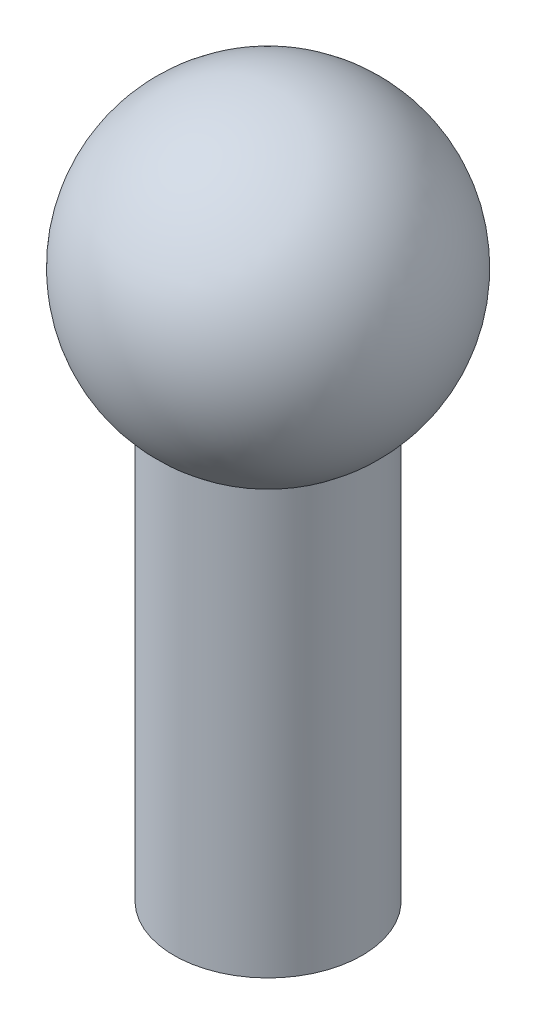
ISO-10303-21;
HEADER;
FILE_DESCRIPTION(('STEP AP214'),'2;1');
FILE_NAME('part.step','',(''),(''),'','','');
FILE_SCHEMA(('AUTOMOTIVE_DESIGN { 1 0 10303 214 1 1 1 1 }'));
ENDSEC;
DATA;
#1=APPLICATION_CONTEXT('core data for automotive mechanical design processes');
#2=APPLICATION_PROTOCOL_DEFINITION('international standard','automotive_design',2000,#1);
#3=PRODUCT_CONTEXT('',#1,'mechanical');
#4=PRODUCT('Part','Part','',(#3));
#5=PRODUCT_RELATED_PRODUCT_CATEGORY('part','',(#4));
#6=PRODUCT_DEFINITION_FORMATION('','',#4);
#7=PRODUCT_DEFINITION_CONTEXT('part definition',#1,'design');
#8=PRODUCT_DEFINITION('design','',#6,#7);
#9=PRODUCT_DEFINITION_SHAPE('','',#8);
#10=(LENGTH_UNIT() NAMED_UNIT(*) SI_UNIT(.MILLI.,.METRE.));
#11=(NAMED_UNIT(*) PLANE_ANGLE_UNIT() SI_UNIT($,.RADIAN.));
#12=(NAMED_UNIT(*) SI_UNIT($,.STERADIAN.) SOLID_ANGLE_UNIT());
#13=UNCERTAINTY_MEASURE_WITH_UNIT(LENGTH_MEASURE(1.E-05),#10,'distance_accuracy_value','');
#14=(GEOMETRIC_REPRESENTATION_CONTEXT(3) GLOBAL_UNCERTAINTY_ASSIGNED_CONTEXT((#13)) GLOBAL_UNIT_ASSIGNED_CONTEXT((#10,
#11,#12)) REPRESENTATION_CONTEXT('',''));
#15=CARTESIAN_POINT('',(0.,0.,0.));
#16=DIRECTION('',(0.,0.,1.));
#17=DIRECTION('',(1.,0.,0.));
#18=AXIS2_PLACEMENT_3D('',#15,#16,#17);
#19=CARTESIAN_POINT('',(0.,70.,0.));
#20=DIRECTION('',(0.,-1.,0.));
#21=DIRECTION('',(1.,0.,0.));
#22=AXIS2_PLACEMENT_3D('',#19,#20,#21);
#23=SPHERICAL_SURFACE('',#22,20.);
#24=CARTESIAN_POINT('',(0.,54.,0.));
#25=DIRECTION('',(0.,-1.,0.));
#26=DIRECTION('',(0.,0.,-1.));
#27=AXIS2_PLACEMENT_3D('',#24,#25,#26);
#28=CIRCLE('',#27,12.);
#29=CARTESIAN_POINT('',(0.,54.,-12.));
#30=VERTEX_POINT('',#29);
#31=EDGE_CURVE('E10',#30,#30,#28,.T.);
#32=ORIENTED_EDGE('',*,*,#31,.F.);
#33=EDGE_LOOP('',(#32));
#34=FACE_BOUND('',#33,.T.);
#35=ADVANCED_FACE('F43',(#34),#23,.T.);
#36=CARTESIAN_POINT('',(0.,0.,0.));
#37=DIRECTION('',(0.,-1.,0.));
#38=DIRECTION('',(0.,0.,-1.));
#39=AXIS2_PLACEMENT_3D('',#36,#37,#38);
#40=CYLINDRICAL_SURFACE('',#39,12.);
#41=CARTESIAN_POINT('',(0.,0.,0.));
#42=DIRECTION('',(0.,-1.,0.));
#43=DIRECTION('',(0.,0.,-1.));
#44=AXIS2_PLACEMENT_3D('',#41,#42,#43);
#45=CIRCLE('',#44,12.);
#46=CARTESIAN_POINT('',(0.,0.,-12.));
#47=VERTEX_POINT('',#46);
#48=EDGE_CURVE('E49',#47,#47,#45,.T.);
#49=ORIENTED_EDGE('',*,*,#48,.F.);
#50=EDGE_LOOP('',(#49));
#51=FACE_BOUND('',#50,.T.);
#52=ORIENTED_EDGE('',*,*,#31,.T.);
#53=EDGE_LOOP('',(#52));
#54=FACE_BOUND('',#53,.T.);
#55=ADVANCED_FACE('F67',(#51,#54),#40,.T.);
#56=CARTESIAN_POINT('',(0.,0.,0.));
#57=DIRECTION('',(0.,1.,0.));
#58=DIRECTION('',(0.,0.,1.));
#59=AXIS2_PLACEMENT_3D('',#56,#57,#58);
#60=PLANE('',#59);
#61=CARTESIAN_POINT('',(0.,0.,0.));
#62=DIRECTION('',(0.,-1.,0.));
#63=DIRECTION('',(0.,0.,-1.));
#64=AXIS2_PLACEMENT_3D('',#61,#62,#63);
#65=CIRCLE('',#64,10.);
#66=CARTESIAN_POINT('',(0.,0.,-10.));
#67=VERTEX_POINT('',#66);
#68=EDGE_CURVE('E57',#67,#67,#65,.T.);
#69=ORIENTED_EDGE('',*,*,#68,.F.);
#70=EDGE_LOOP('',(#69));
#71=FACE_BOUND('',#70,.T.);
#72=ORIENTED_EDGE('',*,*,#48,.T.);
#73=EDGE_LOOP('',(#72));
#74=FACE_BOUND('',#73,.T.);
#75=ADVANCED_FACE('F65',(#71,#74),#60,.F.);
#76=CARTESIAN_POINT('',(0.,30.,0.));
#77=DIRECTION('',(0.,-1.,0.));
#78=DIRECTION('',(0.,0.,-1.));
#79=AXIS2_PLACEMENT_3D('',#76,#77,#78);
#80=CYLINDRICAL_SURFACE('',#79,10.);
#81=CARTESIAN_POINT('',(0.,30.,0.));
#82=DIRECTION('',(0.,-1.,0.));
#83=DIRECTION('',(0.,0.,-1.));
#84=AXIS2_PLACEMENT_3D('',#81,#82,#83);
#85=CIRCLE('',#84,10.);
#86=CARTESIAN_POINT('',(0.,30.,-10.));
#87=VERTEX_POINT('',#86);
#88=EDGE_CURVE('E53',#87,#87,#85,.T.);
#89=ORIENTED_EDGE('',*,*,#88,.F.);
#90=EDGE_LOOP('',(#89));
#91=FACE_BOUND('',#90,.T.);
#92=ORIENTED_EDGE('',*,*,#68,.T.);
#93=EDGE_LOOP('',(#92));
#94=FACE_BOUND('',#93,.T.);
#95=ADVANCED_FACE('F63',(#91,#94),#80,.F.);
#96=CARTESIAN_POINT('',(0.,30.,0.));
#97=DIRECTION('',(0.,-1.,0.));
#98=DIRECTION('',(0.,0.,-1.));
#99=AXIS2_PLACEMENT_3D('',#96,#97,#98);
#100=PLANE('',#99);
#101=ORIENTED_EDGE('',*,*,#88,.T.);
#102=EDGE_LOOP('',(#101));
#103=FACE_BOUND('',#102,.T.);
#104=ADVANCED_FACE('F73',(#103),#100,.T.);
#105=CLOSED_SHELL('',(#35,#55,#75,#95,#104));
#106=MANIFOLD_SOLID_BREP('B2',#105);
#107=ADVANCED_BREP_SHAPE_REPRESENTATION('',(#18,#106),#14);
#108=SHAPE_DEFINITION_REPRESENTATION(#9,#107);
ENDSEC;
END-ISO-10303-21;
